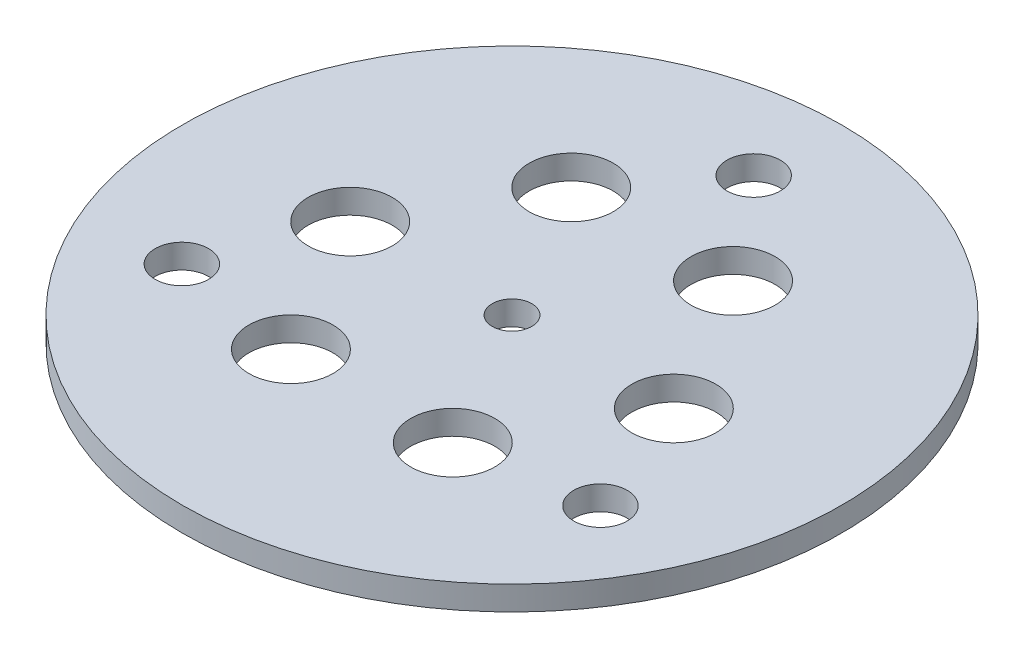
ISO-10303-21;
HEADER;
FILE_DESCRIPTION(('STEP AP214'),'2;1');
FILE_NAME('part.step','',(''),(''),'','','');
FILE_SCHEMA(('AUTOMOTIVE_DESIGN { 1 0 10303 214 1 1 1 1 }'));
ENDSEC;
DATA;
#1=APPLICATION_CONTEXT('core data for automotive mechanical design processes');
#2=APPLICATION_PROTOCOL_DEFINITION('international standard','automotive_design',2000,#1);
#3=PRODUCT_CONTEXT('',#1,'mechanical');
#4=PRODUCT('Part','Part','',(#3));
#5=PRODUCT_RELATED_PRODUCT_CATEGORY('part','',(#4));
#6=PRODUCT_DEFINITION_FORMATION('','',#4);
#7=PRODUCT_DEFINITION_CONTEXT('part definition',#1,'design');
#8=PRODUCT_DEFINITION('design','',#6,#7);
#9=PRODUCT_DEFINITION_SHAPE('','',#8);
#10=(LENGTH_UNIT() NAMED_UNIT(*) SI_UNIT(.MILLI.,.METRE.));
#11=(NAMED_UNIT(*) PLANE_ANGLE_UNIT() SI_UNIT($,.RADIAN.));
#12=(NAMED_UNIT(*) SI_UNIT($,.STERADIAN.) SOLID_ANGLE_UNIT());
#13=UNCERTAINTY_MEASURE_WITH_UNIT(LENGTH_MEASURE(1.E-05),#10,'distance_accuracy_value','');
#14=(GEOMETRIC_REPRESENTATION_CONTEXT(3) GLOBAL_UNCERTAINTY_ASSIGNED_CONTEXT((#13)) GLOBAL_UNIT_ASSIGNED_CONTEXT((#10,
#11,#12)) REPRESENTATION_CONTEXT('',''));
#15=CARTESIAN_POINT('',(0.,0.,0.));
#16=DIRECTION('',(0.,0.,1.));
#17=DIRECTION('',(1.,0.,0.));
#18=AXIS2_PLACEMENT_3D('',#15,#16,#17);
#19=CARTESIAN_POINT('',(0.,5.5,0.));
#20=DIRECTION('',(0.,1.,0.));
#21=DIRECTION('',(0.,0.,1.));
#22=AXIS2_PLACEMENT_3D('',#19,#20,#21);
#23=PLANE('',#22);
#24=CARTESIAN_POINT('',(47.6313972081483,5.5,27.4999999999976));
#25=DIRECTION('',(0.,1.,0.));
#26=DIRECTION('',(0.,0.,1.));
#27=AXIS2_PLACEMENT_3D('',#24,#25,#26);
#28=CIRCLE('',#27,6.075);
#29=CARTESIAN_POINT('',(47.6313972081483,5.5,33.5749999999976));
#30=VERTEX_POINT('',#29);
#31=EDGE_CURVE('E89',#30,#30,#28,.T.);
#32=ORIENTED_EDGE('',*,*,#31,.F.);
#33=EDGE_LOOP('',(#32));
#34=FACE_BOUND('',#33,.T.);
#35=CARTESIAN_POINT('',(-18.4136960905577,5.5,31.8934571839784));
#36=DIRECTION('',(0.,1.,0.));
#37=DIRECTION('',(0.,0.,1.));
#38=AXIS2_PLACEMENT_3D('',#35,#36,#37);
#39=CIRCLE('',#38,9.575);
#40=CARTESIAN_POINT('',(-18.4136960905577,5.5,41.4684571839784));
#41=VERTEX_POINT('',#40);
#42=EDGE_CURVE('E77',#41,#41,#39,.T.);
#43=ORIENTED_EDGE('',*,*,#42,.F.);
#44=EDGE_LOOP('',(#43));
#45=FACE_BOUND('',#44,.T.);
#46=CARTESIAN_POINT('',(36.8273921811154,5.5,0.));
#47=DIRECTION('',(0.,1.,0.));
#48=DIRECTION('',(0.,0.,1.));
#49=AXIS2_PLACEMENT_3D('',#46,#47,#48);
#50=CIRCLE('',#49,9.575);
#51=CARTESIAN_POINT('',(36.8273921811154,5.5,9.57499999999999));
#52=VERTEX_POINT('',#51);
#53=EDGE_CURVE('E65',#52,#52,#50,.T.);
#54=ORIENTED_EDGE('',*,*,#53,.F.);
#55=EDGE_LOOP('',(#54));
#56=FACE_BOUND('',#55,.T.);
#57=CARTESIAN_POINT('',(0.,5.5,-55.));
#58=DIRECTION('',(0.,1.,0.));
#59=DIRECTION('',(0.,0.,1.));
#60=AXIS2_PLACEMENT_3D('',#57,#58,#59);
#61=CIRCLE('',#60,6.075);
#62=CARTESIAN_POINT('',(0.,5.5,-48.925));
#63=VERTEX_POINT('',#62);
#64=EDGE_CURVE('E53',#63,#63,#61,.T.);
#65=ORIENTED_EDGE('',*,*,#64,.F.);
#66=EDGE_LOOP('',(#65));
#67=FACE_BOUND('',#66,.T.);
#68=CARTESIAN_POINT('',(-36.8273921811154,5.5,0.));
#69=DIRECTION('',(0.,1.,0.));
#70=DIRECTION('',(0.,0.,1.));
#71=AXIS2_PLACEMENT_3D('',#68,#69,#70);
#72=CIRCLE('',#71,9.575);
#73=CARTESIAN_POINT('',(-36.8273921811154,5.5,9.57500000000001));
#74=VERTEX_POINT('',#73);
#75=EDGE_CURVE('E42',#74,#74,#72,.T.);
#76=ORIENTED_EDGE('',*,*,#75,.F.);
#77=EDGE_LOOP('',(#76));
#78=FACE_BOUND('',#77,.T.);
#79=CARTESIAN_POINT('',(0.,5.5,0.));
#80=DIRECTION('',(0.,1.,0.));
#81=DIRECTION('',(0.,0.,1.));
#82=AXIS2_PLACEMENT_3D('',#79,#80,#81);
#83=CIRCLE('',#82,75.);
#84=CARTESIAN_POINT('',(0.,5.5,75.));
#85=VERTEX_POINT('',#84);
#86=EDGE_CURVE('E10',#85,#85,#83,.T.);
#87=ORIENTED_EDGE('',*,*,#86,.T.);
#88=EDGE_LOOP('',(#87));
#89=FACE_BOUND('',#88,.T.);
#90=CARTESIAN_POINT('',(-18.4136960905577,5.5,-31.8934571839783));
#91=DIRECTION('',(0.,1.,0.));
#92=DIRECTION('',(0.,0.,1.));
#93=AXIS2_PLACEMENT_3D('',#90,#91,#92);
#94=CIRCLE('',#93,9.575);
#95=CARTESIAN_POINT('',(-18.4136960905577,5.5,-22.3184571839783));
#96=VERTEX_POINT('',#95);
#97=EDGE_CURVE('E47',#96,#96,#94,.T.);
#98=ORIENTED_EDGE('',*,*,#97,.F.);
#99=EDGE_LOOP('',(#98));
#100=FACE_BOUND('',#99,.T.);
#101=CARTESIAN_POINT('',(18.4136960905577,5.5,-31.8934571839783));
#102=DIRECTION('',(0.,1.,0.));
#103=DIRECTION('',(0.,0.,1.));
#104=AXIS2_PLACEMENT_3D('',#101,#102,#103);
#105=CIRCLE('',#104,9.575);
#106=CARTESIAN_POINT('',(18.4136960905577,5.5,-22.3184571839783));
#107=VERTEX_POINT('',#106);
#108=EDGE_CURVE('E59',#107,#107,#105,.T.);
#109=ORIENTED_EDGE('',*,*,#108,.F.);
#110=EDGE_LOOP('',(#109));
#111=FACE_BOUND('',#110,.T.);
#112=CARTESIAN_POINT('',(18.4136960905577,5.5,31.8934571839783));
#113=DIRECTION('',(0.,1.,0.));
#114=DIRECTION('',(0.,0.,1.));
#115=AXIS2_PLACEMENT_3D('',#112,#113,#114);
#116=CIRCLE('',#115,9.575);
#117=CARTESIAN_POINT('',(18.4136960905577,5.5,41.4684571839783));
#118=VERTEX_POINT('',#117);
#119=EDGE_CURVE('E71',#118,#118,#116,.T.);
#120=ORIENTED_EDGE('',*,*,#119,.F.);
#121=EDGE_LOOP('',(#120));
#122=FACE_BOUND('',#121,.T.);
#123=CARTESIAN_POINT('',(0.,5.5,0.));
#124=DIRECTION('',(0.,1.,0.));
#125=DIRECTION('',(0.,0.,1.));
#126=AXIS2_PLACEMENT_3D('',#123,#124,#125);
#127=CIRCLE('',#126,4.5);
#128=CARTESIAN_POINT('',(0.,5.5,4.5));
#129=VERTEX_POINT('',#128);
#130=EDGE_CURVE('E83',#129,#129,#127,.T.);
#131=ORIENTED_EDGE('',*,*,#130,.F.);
#132=EDGE_LOOP('',(#131));
#133=FACE_BOUND('',#132,.T.);
#134=CARTESIAN_POINT('',(-47.63139720814,5.5,27.5000000000024));
#135=DIRECTION('',(0.,1.,0.));
#136=DIRECTION('',(0.,0.,1.));
#137=AXIS2_PLACEMENT_3D('',#134,#135,#136);
#138=CIRCLE('',#137,6.075);
#139=CARTESIAN_POINT('',(-47.63139720814,5.5,33.5750000000024));
#140=VERTEX_POINT('',#139);
#141=EDGE_CURVE('E95',#140,#140,#138,.T.);
#142=ORIENTED_EDGE('',*,*,#141,.F.);
#143=EDGE_LOOP('',(#142));
#144=FACE_BOUND('',#143,.T.);
#145=ADVANCED_FACE('F31',(#34,#45,#56,#67,#78,#89,#100,#111,#122,#133,#144),#23,.T.);
#146=CARTESIAN_POINT('',(0.,0.,0.));
#147=DIRECTION('',(0.,1.,0.));
#148=DIRECTION('',(0.,0.,1.));
#149=AXIS2_PLACEMENT_3D('',#146,#147,#148);
#150=PLANE('',#149);
#151=CARTESIAN_POINT('',(0.,0.,0.));
#152=DIRECTION('',(0.,1.,0.));
#153=DIRECTION('',(0.,0.,1.));
#154=AXIS2_PLACEMENT_3D('',#151,#152,#153);
#155=CIRCLE('',#154,75.);
#156=CARTESIAN_POINT('',(0.,0.,75.));
#157=VERTEX_POINT('',#156);
#158=EDGE_CURVE('E35',#157,#157,#155,.T.);
#159=ORIENTED_EDGE('',*,*,#158,.F.);
#160=EDGE_LOOP('',(#159));
#161=FACE_BOUND('',#160,.T.);
#162=CARTESIAN_POINT('',(-36.8273921811154,0.,0.));
#163=DIRECTION('',(0.,1.,0.));
#164=DIRECTION('',(0.,0.,1.));
#165=AXIS2_PLACEMENT_3D('',#162,#163,#164);
#166=CIRCLE('',#165,9.575);
#167=CARTESIAN_POINT('',(-36.8273921811154,0.,9.57500000000001));
#168=VERTEX_POINT('',#167);
#169=EDGE_CURVE('E44',#168,#168,#166,.T.);
#170=ORIENTED_EDGE('',*,*,#169,.T.);
#171=EDGE_LOOP('',(#170));
#172=FACE_BOUND('',#171,.T.);
#173=CARTESIAN_POINT('',(-18.4136960905577,0.,-31.8934571839783));
#174=DIRECTION('',(0.,1.,0.));
#175=DIRECTION('',(0.,0.,1.));
#176=AXIS2_PLACEMENT_3D('',#173,#174,#175);
#177=CIRCLE('',#176,9.575);
#178=CARTESIAN_POINT('',(-18.4136960905577,0.,-22.3184571839783));
#179=VERTEX_POINT('',#178);
#180=EDGE_CURVE('E50',#179,#179,#177,.T.);
#181=ORIENTED_EDGE('',*,*,#180,.T.);
#182=EDGE_LOOP('',(#181));
#183=FACE_BOUND('',#182,.T.);
#184=CARTESIAN_POINT('',(0.,0.,-55.));
#185=DIRECTION('',(0.,1.,0.));
#186=DIRECTION('',(0.,0.,1.));
#187=AXIS2_PLACEMENT_3D('',#184,#185,#186);
#188=CIRCLE('',#187,6.075);
#189=CARTESIAN_POINT('',(0.,0.,-48.925));
#190=VERTEX_POINT('',#189);
#191=EDGE_CURVE('E56',#190,#190,#188,.T.);
#192=ORIENTED_EDGE('',*,*,#191,.T.);
#193=EDGE_LOOP('',(#192));
#194=FACE_BOUND('',#193,.T.);
#195=CARTESIAN_POINT('',(18.4136960905577,0.,-31.8934571839783));
#196=DIRECTION('',(0.,1.,0.));
#197=DIRECTION('',(0.,0.,1.));
#198=AXIS2_PLACEMENT_3D('',#195,#196,#197);
#199=CIRCLE('',#198,9.575);
#200=CARTESIAN_POINT('',(18.4136960905577,0.,-22.3184571839783));
#201=VERTEX_POINT('',#200);
#202=EDGE_CURVE('E62',#201,#201,#199,.T.);
#203=ORIENTED_EDGE('',*,*,#202,.T.);
#204=EDGE_LOOP('',(#203));
#205=FACE_BOUND('',#204,.T.);
#206=CARTESIAN_POINT('',(36.8273921811154,0.,0.));
#207=DIRECTION('',(0.,1.,0.));
#208=DIRECTION('',(0.,0.,1.));
#209=AXIS2_PLACEMENT_3D('',#206,#207,#208);
#210=CIRCLE('',#209,9.575);
#211=CARTESIAN_POINT('',(36.8273921811154,0.,9.57499999999999));
#212=VERTEX_POINT('',#211);
#213=EDGE_CURVE('E68',#212,#212,#210,.T.);
#214=ORIENTED_EDGE('',*,*,#213,.T.);
#215=EDGE_LOOP('',(#214));
#216=FACE_BOUND('',#215,.T.);
#217=CARTESIAN_POINT('',(18.4136960905577,0.,31.8934571839783));
#218=DIRECTION('',(0.,1.,0.));
#219=DIRECTION('',(0.,0.,1.));
#220=AXIS2_PLACEMENT_3D('',#217,#218,#219);
#221=CIRCLE('',#220,9.575);
#222=CARTESIAN_POINT('',(18.4136960905577,0.,41.4684571839783));
#223=VERTEX_POINT('',#222);
#224=EDGE_CURVE('E74',#223,#223,#221,.T.);
#225=ORIENTED_EDGE('',*,*,#224,.T.);
#226=EDGE_LOOP('',(#225));
#227=FACE_BOUND('',#226,.T.);
#228=CARTESIAN_POINT('',(-18.4136960905577,0.,31.8934571839784));
#229=DIRECTION('',(0.,1.,0.));
#230=DIRECTION('',(0.,0.,1.));
#231=AXIS2_PLACEMENT_3D('',#228,#229,#230);
#232=CIRCLE('',#231,9.575);
#233=CARTESIAN_POINT('',(-18.4136960905577,0.,41.4684571839784));
#234=VERTEX_POINT('',#233);
#235=EDGE_CURVE('E80',#234,#234,#232,.T.);
#236=ORIENTED_EDGE('',*,*,#235,.T.);
#237=EDGE_LOOP('',(#236));
#238=FACE_BOUND('',#237,.T.);
#239=CARTESIAN_POINT('',(0.,0.,0.));
#240=DIRECTION('',(0.,1.,0.));
#241=DIRECTION('',(0.,0.,1.));
#242=AXIS2_PLACEMENT_3D('',#239,#240,#241);
#243=CIRCLE('',#242,4.5);
#244=CARTESIAN_POINT('',(0.,0.,4.5));
#245=VERTEX_POINT('',#244);
#246=EDGE_CURVE('E86',#245,#245,#243,.T.);
#247=ORIENTED_EDGE('',*,*,#246,.T.);
#248=EDGE_LOOP('',(#247));
#249=FACE_BOUND('',#248,.T.);
#250=CARTESIAN_POINT('',(47.6313972081483,0.,27.4999999999976));
#251=DIRECTION('',(0.,1.,0.));
#252=DIRECTION('',(0.,0.,1.));
#253=AXIS2_PLACEMENT_3D('',#250,#251,#252);
#254=CIRCLE('',#253,6.075);
#255=CARTESIAN_POINT('',(47.6313972081483,0.,33.5749999999976));
#256=VERTEX_POINT('',#255);
#257=EDGE_CURVE('E92',#256,#256,#254,.T.);
#258=ORIENTED_EDGE('',*,*,#257,.T.);
#259=EDGE_LOOP('',(#258));
#260=FACE_BOUND('',#259,.T.);
#261=CARTESIAN_POINT('',(-47.63139720814,0.,27.5000000000024));
#262=DIRECTION('',(0.,1.,0.));
#263=DIRECTION('',(0.,0.,1.));
#264=AXIS2_PLACEMENT_3D('',#261,#262,#263);
#265=CIRCLE('',#264,6.075);
#266=CARTESIAN_POINT('',(-47.63139720814,0.,33.5750000000024));
#267=VERTEX_POINT('',#266);
#268=EDGE_CURVE('E98',#267,#267,#265,.T.);
#269=ORIENTED_EDGE('',*,*,#268,.T.);
#270=EDGE_LOOP('',(#269));
#271=FACE_BOUND('',#270,.T.);
#272=ADVANCED_FACE('F108',(#161,#172,#183,#194,#205,#216,#227,#238,#249,#260,#271),#150,.F.);
#273=CARTESIAN_POINT('',(0.,5.5,0.));
#274=DIRECTION('',(0.,-1.,0.));
#275=DIRECTION('',(0.,0.,-1.));
#276=AXIS2_PLACEMENT_3D('',#273,#274,#275);
#277=CYLINDRICAL_SURFACE('',#276,75.);
#278=ORIENTED_EDGE('',*,*,#86,.F.);
#279=EDGE_LOOP('',(#278));
#280=FACE_BOUND('',#279,.T.);
#281=ORIENTED_EDGE('',*,*,#158,.T.);
#282=EDGE_LOOP('',(#281));
#283=FACE_BOUND('',#282,.T.);
#284=ADVANCED_FACE('F33',(#280,#283),#277,.T.);
#285=CARTESIAN_POINT('',(-36.8273921811154,5.5,0.));
#286=DIRECTION('',(0.,-1.,0.));
#287=DIRECTION('',(0.,0.,-1.));
#288=AXIS2_PLACEMENT_3D('',#285,#286,#287);
#289=CYLINDRICAL_SURFACE('',#288,9.575);
#290=ORIENTED_EDGE('',*,*,#75,.T.);
#291=EDGE_LOOP('',(#290));
#292=FACE_BOUND('',#291,.T.);
#293=ORIENTED_EDGE('',*,*,#169,.F.);
#294=EDGE_LOOP('',(#293));
#295=FACE_BOUND('',#294,.T.);
#296=ADVANCED_FACE('F118',(#292,#295),#289,.F.);
#297=CARTESIAN_POINT('',(-18.4136960905577,5.5,-31.8934571839783));
#298=DIRECTION('',(0.,-1.,0.));
#299=DIRECTION('',(0.,0.,-1.));
#300=AXIS2_PLACEMENT_3D('',#297,#298,#299);
#301=CYLINDRICAL_SURFACE('',#300,9.575);
#302=ORIENTED_EDGE('',*,*,#97,.T.);
#303=EDGE_LOOP('',(#302));
#304=FACE_BOUND('',#303,.T.);
#305=ORIENTED_EDGE('',*,*,#180,.F.);
#306=EDGE_LOOP('',(#305));
#307=FACE_BOUND('',#306,.T.);
#308=ADVANCED_FACE('F121',(#304,#307),#301,.F.);
#309=CARTESIAN_POINT('',(0.,5.5,-55.));
#310=DIRECTION('',(0.,-1.,0.));
#311=DIRECTION('',(0.,0.,-1.));
#312=AXIS2_PLACEMENT_3D('',#309,#310,#311);
#313=CYLINDRICAL_SURFACE('',#312,6.075);
#314=ORIENTED_EDGE('',*,*,#64,.T.);
#315=EDGE_LOOP('',(#314));
#316=FACE_BOUND('',#315,.T.);
#317=ORIENTED_EDGE('',*,*,#191,.F.);
#318=EDGE_LOOP('',(#317));
#319=FACE_BOUND('',#318,.T.);
#320=ADVANCED_FACE('F125',(#316,#319),#313,.F.);
#321=CARTESIAN_POINT('',(18.4136960905577,5.5,-31.8934571839783));
#322=DIRECTION('',(0.,-1.,0.));
#323=DIRECTION('',(0.,0.,-1.));
#324=AXIS2_PLACEMENT_3D('',#321,#322,#323);
#325=CYLINDRICAL_SURFACE('',#324,9.575);
#326=ORIENTED_EDGE('',*,*,#108,.T.);
#327=EDGE_LOOP('',(#326));
#328=FACE_BOUND('',#327,.T.);
#329=ORIENTED_EDGE('',*,*,#202,.F.);
#330=EDGE_LOOP('',(#329));
#331=FACE_BOUND('',#330,.T.);
#332=ADVANCED_FACE('F129',(#328,#331),#325,.F.);
#333=CARTESIAN_POINT('',(36.8273921811154,5.5,0.));
#334=DIRECTION('',(0.,-1.,0.));
#335=DIRECTION('',(0.,0.,-1.));
#336=AXIS2_PLACEMENT_3D('',#333,#334,#335);
#337=CYLINDRICAL_SURFACE('',#336,9.575);
#338=ORIENTED_EDGE('',*,*,#53,.T.);
#339=EDGE_LOOP('',(#338));
#340=FACE_BOUND('',#339,.T.);
#341=ORIENTED_EDGE('',*,*,#213,.F.);
#342=EDGE_LOOP('',(#341));
#343=FACE_BOUND('',#342,.T.);
#344=ADVANCED_FACE('F133',(#340,#343),#337,.F.);
#345=CARTESIAN_POINT('',(18.4136960905577,5.5,31.8934571839783));
#346=DIRECTION('',(0.,-1.,0.));
#347=DIRECTION('',(0.,0.,-1.));
#348=AXIS2_PLACEMENT_3D('',#345,#346,#347);
#349=CYLINDRICAL_SURFACE('',#348,9.575);
#350=ORIENTED_EDGE('',*,*,#119,.T.);
#351=EDGE_LOOP('',(#350));
#352=FACE_BOUND('',#351,.T.);
#353=ORIENTED_EDGE('',*,*,#224,.F.);
#354=EDGE_LOOP('',(#353));
#355=FACE_BOUND('',#354,.T.);
#356=ADVANCED_FACE('F137',(#352,#355),#349,.F.);
#357=CARTESIAN_POINT('',(-18.4136960905577,5.5,31.8934571839784));
#358=DIRECTION('',(0.,-1.,0.));
#359=DIRECTION('',(0.,0.,-1.));
#360=AXIS2_PLACEMENT_3D('',#357,#358,#359);
#361=CYLINDRICAL_SURFACE('',#360,9.575);
#362=ORIENTED_EDGE('',*,*,#42,.T.);
#363=EDGE_LOOP('',(#362));
#364=FACE_BOUND('',#363,.T.);
#365=ORIENTED_EDGE('',*,*,#235,.F.);
#366=EDGE_LOOP('',(#365));
#367=FACE_BOUND('',#366,.T.);
#368=ADVANCED_FACE('F141',(#364,#367),#361,.F.);
#369=CARTESIAN_POINT('',(0.,5.5,0.));
#370=DIRECTION('',(0.,-1.,0.));
#371=DIRECTION('',(0.,0.,-1.));
#372=AXIS2_PLACEMENT_3D('',#369,#370,#371);
#373=CYLINDRICAL_SURFACE('',#372,4.5);
#374=ORIENTED_EDGE('',*,*,#130,.T.);
#375=EDGE_LOOP('',(#374));
#376=FACE_BOUND('',#375,.T.);
#377=ORIENTED_EDGE('',*,*,#246,.F.);
#378=EDGE_LOOP('',(#377));
#379=FACE_BOUND('',#378,.T.);
#380=ADVANCED_FACE('F145',(#376,#379),#373,.F.);
#381=CARTESIAN_POINT('',(47.6313972081483,5.5,27.4999999999976));
#382=DIRECTION('',(0.,-1.,0.));
#383=DIRECTION('',(0.,0.,-1.));
#384=AXIS2_PLACEMENT_3D('',#381,#382,#383);
#385=CYLINDRICAL_SURFACE('',#384,6.075);
#386=ORIENTED_EDGE('',*,*,#31,.T.);
#387=EDGE_LOOP('',(#386));
#388=FACE_BOUND('',#387,.T.);
#389=ORIENTED_EDGE('',*,*,#257,.F.);
#390=EDGE_LOOP('',(#389));
#391=FACE_BOUND('',#390,.T.);
#392=ADVANCED_FACE('F149',(#388,#391),#385,.F.);
#393=CARTESIAN_POINT('',(-47.63139720814,5.5,27.5000000000024));
#394=DIRECTION('',(0.,-1.,0.));
#395=DIRECTION('',(0.,0.,-1.));
#396=AXIS2_PLACEMENT_3D('',#393,#394,#395);
#397=CYLINDRICAL_SURFACE('',#396,6.075);
#398=ORIENTED_EDGE('',*,*,#141,.T.);
#399=EDGE_LOOP('',(#398));
#400=FACE_BOUND('',#399,.T.);
#401=ORIENTED_EDGE('',*,*,#268,.F.);
#402=EDGE_LOOP('',(#401));
#403=FACE_BOUND('',#402,.T.);
#404=ADVANCED_FACE('F104',(#400,#403),#397,.F.);
#405=CLOSED_SHELL('',(#145,#272,#284,#296,#308,#320,#332,#344,#356,#368,#380,#392,#404));
#406=MANIFOLD_SOLID_BREP('B2',#405);
#407=ADVANCED_BREP_SHAPE_REPRESENTATION('',(#18,#406),#14);
#408=SHAPE_DEFINITION_REPRESENTATION(#9,#407);
ENDSEC;
END-ISO-10303-21;
